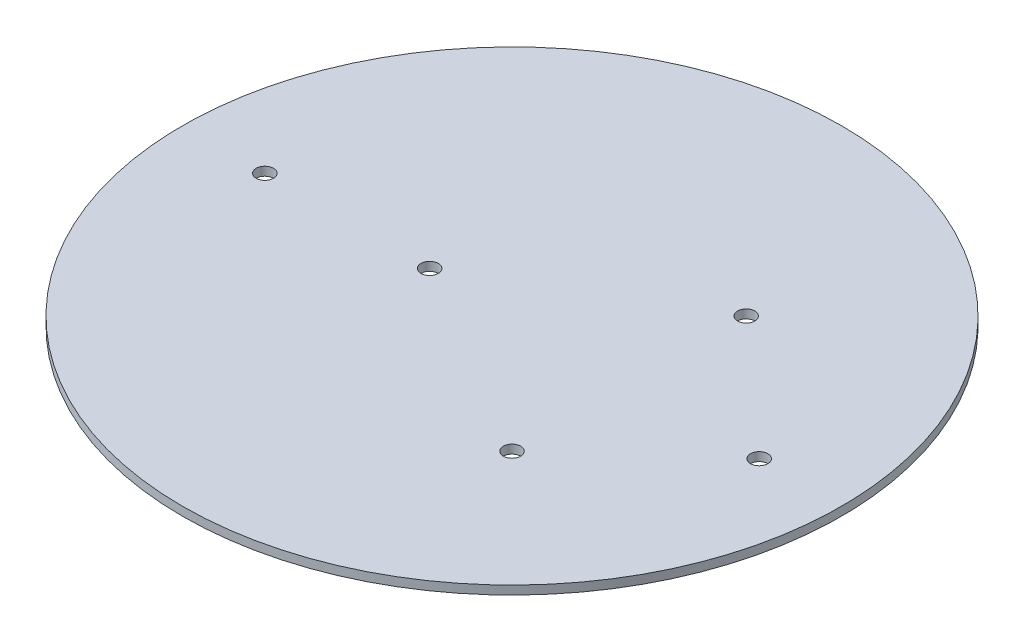
ISO-10303-21;
HEADER;
FILE_DESCRIPTION(('STEP AP214'),'2;1');
FILE_NAME('part.step','',(''),(''),'','','');
FILE_SCHEMA(('AUTOMOTIVE_DESIGN { 1 0 10303 214 1 1 1 1 }'));
ENDSEC;
DATA;
#1=APPLICATION_CONTEXT('core data for automotive mechanical design processes');
#2=APPLICATION_PROTOCOL_DEFINITION('international standard','automotive_design',2000,#1);
#3=PRODUCT_CONTEXT('',#1,'mechanical');
#4=PRODUCT('Part','Part','',(#3));
#5=PRODUCT_RELATED_PRODUCT_CATEGORY('part','',(#4));
#6=PRODUCT_DEFINITION_FORMATION('','',#4);
#7=PRODUCT_DEFINITION_CONTEXT('part definition',#1,'design');
#8=PRODUCT_DEFINITION('design','',#6,#7);
#9=PRODUCT_DEFINITION_SHAPE('','',#8);
#10=(LENGTH_UNIT() NAMED_UNIT(*) SI_UNIT(.MILLI.,.METRE.));
#11=(NAMED_UNIT(*) PLANE_ANGLE_UNIT() SI_UNIT($,.RADIAN.));
#12=(NAMED_UNIT(*) SI_UNIT($,.STERADIAN.) SOLID_ANGLE_UNIT());
#13=UNCERTAINTY_MEASURE_WITH_UNIT(LENGTH_MEASURE(1.E-05),#10,'distance_accuracy_value','');
#14=(GEOMETRIC_REPRESENTATION_CONTEXT(3) GLOBAL_UNCERTAINTY_ASSIGNED_CONTEXT((#13)) GLOBAL_UNIT_ASSIGNED_CONTEXT((#10,
#11,#12)) REPRESENTATION_CONTEXT('',''));
#15=CARTESIAN_POINT('',(0.,0.,0.));
#16=DIRECTION('',(0.,0.,1.));
#17=DIRECTION('',(1.,0.,0.));
#18=AXIS2_PLACEMENT_3D('',#15,#16,#17);
#19=CARTESIAN_POINT('',(-28.5,-1.,0.));
#20=DIRECTION('',(0.,1.,0.));
#21=DIRECTION('',(0.,0.,1.));
#22=AXIS2_PLACEMENT_3D('',#19,#20,#21);
#23=CYLINDRICAL_SURFACE('',#22,1.);
#24=CARTESIAN_POINT('',(-28.5,-1.,0.));
#25=DIRECTION('',(0.,1.,0.));
#26=DIRECTION('',(0.,0.,1.));
#27=AXIS2_PLACEMENT_3D('',#24,#25,#26);
#28=CIRCLE('',#27,1.);
#29=CARTESIAN_POINT('',(-28.5,-1.,1.));
#30=VERTEX_POINT('',#29);
#31=EDGE_CURVE('E52',#30,#30,#28,.T.);
#32=ORIENTED_EDGE('',*,*,#31,.F.);
#33=EDGE_LOOP('',(#32));
#34=FACE_BOUND('',#33,.T.);
#35=CARTESIAN_POINT('',(-28.5,0.,0.));
#36=DIRECTION('',(0.,1.,0.));
#37=DIRECTION('',(0.,0.,1.));
#38=AXIS2_PLACEMENT_3D('',#35,#36,#37);
#39=CIRCLE('',#38,1.);
#40=CARTESIAN_POINT('',(-28.5,0.,1.));
#41=VERTEX_POINT('',#40);
#42=EDGE_CURVE('E77',#41,#41,#39,.T.);
#43=ORIENTED_EDGE('',*,*,#42,.T.);
#44=EDGE_LOOP('',(#43));
#45=FACE_BOUND('',#44,.T.);
#46=ADVANCED_FACE('F43',(#34,#45),#23,.F.);
#47=CARTESIAN_POINT('',(28.5,-1.,0.));
#48=DIRECTION('',(0.,1.,0.));
#49=DIRECTION('',(0.,0.,1.));
#50=AXIS2_PLACEMENT_3D('',#47,#48,#49);
#51=CYLINDRICAL_SURFACE('',#50,1.);
#52=CARTESIAN_POINT('',(28.5,-1.,0.));
#53=DIRECTION('',(0.,1.,0.));
#54=DIRECTION('',(0.,0.,1.));
#55=AXIS2_PLACEMENT_3D('',#52,#53,#54);
#56=CIRCLE('',#55,1.);
#57=CARTESIAN_POINT('',(28.5,-1.,0.999999999999991));
#58=VERTEX_POINT('',#57);
#59=EDGE_CURVE('E58',#58,#58,#56,.T.);
#60=ORIENTED_EDGE('',*,*,#59,.F.);
#61=EDGE_LOOP('',(#60));
#62=FACE_BOUND('',#61,.T.);
#63=CARTESIAN_POINT('',(28.5,0.,0.));
#64=DIRECTION('',(0.,1.,0.));
#65=DIRECTION('',(0.,0.,1.));
#66=AXIS2_PLACEMENT_3D('',#63,#64,#65);
#67=CIRCLE('',#66,1.);
#68=CARTESIAN_POINT('',(28.5,0.,0.999999999999991));
#69=VERTEX_POINT('',#68);
#70=EDGE_CURVE('E74',#69,#69,#67,.T.);
#71=ORIENTED_EDGE('',*,*,#70,.T.);
#72=EDGE_LOOP('',(#71));
#73=FACE_BOUND('',#72,.T.);
#74=ADVANCED_FACE('F107',(#62,#73),#51,.F.);
#75=CARTESIAN_POINT('',(-9.5,-1.,0.));
#76=DIRECTION('',(0.,1.,0.));
#77=DIRECTION('',(0.,0.,1.));
#78=AXIS2_PLACEMENT_3D('',#75,#76,#77);
#79=CYLINDRICAL_SURFACE('',#78,1.);
#80=CARTESIAN_POINT('',(-9.5,-1.,0.));
#81=DIRECTION('',(0.,1.,0.));
#82=DIRECTION('',(0.,0.,1.));
#83=AXIS2_PLACEMENT_3D('',#80,#81,#82);
#84=CIRCLE('',#83,1.);
#85=CARTESIAN_POINT('',(-9.5,-1.,1.));
#86=VERTEX_POINT('',#85);
#87=EDGE_CURVE('E95',#86,#86,#84,.T.);
#88=ORIENTED_EDGE('',*,*,#87,.F.);
#89=EDGE_LOOP('',(#88));
#90=FACE_BOUND('',#89,.T.);
#91=CARTESIAN_POINT('',(-9.5,0.,0.));
#92=DIRECTION('',(0.,1.,0.));
#93=DIRECTION('',(0.,0.,1.));
#94=AXIS2_PLACEMENT_3D('',#91,#92,#93);
#95=CIRCLE('',#94,1.);
#96=CARTESIAN_POINT('',(-9.5,0.,1.));
#97=VERTEX_POINT('',#96);
#98=EDGE_CURVE('E70',#97,#97,#95,.T.);
#99=ORIENTED_EDGE('',*,*,#98,.T.);
#100=EDGE_LOOP('',(#99));
#101=FACE_BOUND('',#100,.T.);
#102=ADVANCED_FACE('F110',(#90,#101),#79,.F.);
#103=CARTESIAN_POINT('',(13.5,-1.,-13.5));
#104=DIRECTION('',(0.,1.,0.));
#105=DIRECTION('',(0.,0.,1.));
#106=AXIS2_PLACEMENT_3D('',#103,#104,#105);
#107=CYLINDRICAL_SURFACE('',#106,0.999999999999999);
#108=CARTESIAN_POINT('',(13.5,-1.,-13.5));
#109=DIRECTION('',(0.,1.,0.));
#110=DIRECTION('',(0.,0.,1.));
#111=AXIS2_PLACEMENT_3D('',#108,#109,#110);
#112=CIRCLE('',#111,0.999999999999999);
#113=CARTESIAN_POINT('',(13.5,-1.,-12.5));
#114=VERTEX_POINT('',#113);
#115=EDGE_CURVE('E89',#114,#114,#112,.T.);
#116=ORIENTED_EDGE('',*,*,#115,.F.);
#117=EDGE_LOOP('',(#116));
#118=FACE_BOUND('',#117,.T.);
#119=CARTESIAN_POINT('',(13.5,0.,-13.5));
#120=DIRECTION('',(0.,1.,0.));
#121=DIRECTION('',(0.,0.,1.));
#122=AXIS2_PLACEMENT_3D('',#119,#120,#121);
#123=CIRCLE('',#122,0.999999999999999);
#124=CARTESIAN_POINT('',(13.5,0.,-12.5));
#125=VERTEX_POINT('',#124);
#126=EDGE_CURVE('E66',#125,#125,#123,.T.);
#127=ORIENTED_EDGE('',*,*,#126,.T.);
#128=EDGE_LOOP('',(#127));
#129=FACE_BOUND('',#128,.T.);
#130=ADVANCED_FACE('F135',(#118,#129),#107,.F.);
#131=CARTESIAN_POINT('',(13.5,-1.,13.5));
#132=DIRECTION('',(0.,1.,0.));
#133=DIRECTION('',(0.,0.,1.));
#134=AXIS2_PLACEMENT_3D('',#131,#132,#133);
#135=CYLINDRICAL_SURFACE('',#134,0.999999999999999);
#136=CARTESIAN_POINT('',(13.5,-1.,13.5));
#137=DIRECTION('',(0.,1.,0.));
#138=DIRECTION('',(0.,0.,1.));
#139=AXIS2_PLACEMENT_3D('',#136,#137,#138);
#140=CIRCLE('',#139,0.999999999999999);
#141=CARTESIAN_POINT('',(13.5,-1.,14.5));
#142=VERTEX_POINT('',#141);
#143=EDGE_CURVE('E84',#142,#142,#140,.T.);
#144=ORIENTED_EDGE('',*,*,#143,.F.);
#145=EDGE_LOOP('',(#144));
#146=FACE_BOUND('',#145,.T.);
#147=CARTESIAN_POINT('',(13.5,0.,13.5));
#148=DIRECTION('',(0.,1.,0.));
#149=DIRECTION('',(0.,0.,1.));
#150=AXIS2_PLACEMENT_3D('',#147,#148,#149);
#151=CIRCLE('',#150,0.999999999999999);
#152=CARTESIAN_POINT('',(13.5,0.,14.5));
#153=VERTEX_POINT('',#152);
#154=EDGE_CURVE('E62',#153,#153,#151,.T.);
#155=ORIENTED_EDGE('',*,*,#154,.T.);
#156=EDGE_LOOP('',(#155));
#157=FACE_BOUND('',#156,.T.);
#158=ADVANCED_FACE('F45',(#146,#157),#135,.F.);
#159=CARTESIAN_POINT('',(0.,-1.,0.));
#160=DIRECTION('',(0.,1.,0.));
#161=DIRECTION('',(0.,0.,1.));
#162=AXIS2_PLACEMENT_3D('',#159,#160,#161);
#163=CYLINDRICAL_SURFACE('',#162,38.);
#164=CARTESIAN_POINT('',(0.,-1.,0.));
#165=DIRECTION('',(0.,1.,0.));
#166=DIRECTION('',(0.,0.,1.));
#167=AXIS2_PLACEMENT_3D('',#164,#165,#166);
#168=CIRCLE('',#167,38.);
#169=CARTESIAN_POINT('',(0.,-1.,38.));
#170=VERTEX_POINT('',#169);
#171=EDGE_CURVE('E10',#170,#170,#168,.T.);
#172=ORIENTED_EDGE('',*,*,#171,.T.);
#173=EDGE_LOOP('',(#172));
#174=FACE_BOUND('',#173,.T.);
#175=CARTESIAN_POINT('',(0.,0.,0.));
#176=DIRECTION('',(0.,1.,0.));
#177=DIRECTION('',(0.,0.,1.));
#178=AXIS2_PLACEMENT_3D('',#175,#176,#177);
#179=CIRCLE('',#178,38.);
#180=CARTESIAN_POINT('',(0.,0.,38.));
#181=VERTEX_POINT('',#180);
#182=EDGE_CURVE('E47',#181,#181,#179,.T.);
#183=ORIENTED_EDGE('',*,*,#182,.F.);
#184=EDGE_LOOP('',(#183));
#185=FACE_BOUND('',#184,.T.);
#186=ADVANCED_FACE('F122',(#174,#185),#163,.T.);
#187=CARTESIAN_POINT('',(0.,-1.,0.));
#188=DIRECTION('',(0.,1.,0.));
#189=DIRECTION('',(0.,0.,1.));
#190=AXIS2_PLACEMENT_3D('',#187,#188,#189);
#191=PLANE('',#190);
#192=ORIENTED_EDGE('',*,*,#143,.T.);
#193=EDGE_LOOP('',(#192));
#194=FACE_BOUND('',#193,.T.);
#195=ORIENTED_EDGE('',*,*,#115,.T.);
#196=EDGE_LOOP('',(#195));
#197=FACE_BOUND('',#196,.T.);
#198=ORIENTED_EDGE('',*,*,#87,.T.);
#199=EDGE_LOOP('',(#198));
#200=FACE_BOUND('',#199,.T.);
#201=ORIENTED_EDGE('',*,*,#59,.T.);
#202=EDGE_LOOP('',(#201));
#203=FACE_BOUND('',#202,.T.);
#204=ORIENTED_EDGE('',*,*,#31,.T.);
#205=EDGE_LOOP('',(#204));
#206=FACE_BOUND('',#205,.T.);
#207=ORIENTED_EDGE('',*,*,#171,.F.);
#208=EDGE_LOOP('',(#207));
#209=FACE_BOUND('',#208,.T.);
#210=ADVANCED_FACE('F104',(#194,#197,#200,#203,#206,#209),#191,.F.);
#211=CARTESIAN_POINT('',(0.,0.,0.));
#212=DIRECTION('',(0.,1.,0.));
#213=DIRECTION('',(0.,0.,1.));
#214=AXIS2_PLACEMENT_3D('',#211,#212,#213);
#215=PLANE('',#214);
#216=ORIENTED_EDGE('',*,*,#154,.F.);
#217=EDGE_LOOP('',(#216));
#218=FACE_BOUND('',#217,.T.);
#219=ORIENTED_EDGE('',*,*,#126,.F.);
#220=EDGE_LOOP('',(#219));
#221=FACE_BOUND('',#220,.T.);
#222=ORIENTED_EDGE('',*,*,#98,.F.);
#223=EDGE_LOOP('',(#222));
#224=FACE_BOUND('',#223,.T.);
#225=ORIENTED_EDGE('',*,*,#70,.F.);
#226=EDGE_LOOP('',(#225));
#227=FACE_BOUND('',#226,.T.);
#228=ORIENTED_EDGE('',*,*,#42,.F.);
#229=EDGE_LOOP('',(#228));
#230=FACE_BOUND('',#229,.T.);
#231=ORIENTED_EDGE('',*,*,#182,.T.);
#232=EDGE_LOOP('',(#231));
#233=FACE_BOUND('',#232,.T.);
#234=ADVANCED_FACE('F114',(#218,#221,#224,#227,#230,#233),#215,.T.);
#235=CLOSED_SHELL('',(#46,#74,#102,#130,#158,#186,#210,#234));
#236=MANIFOLD_SOLID_BREP('B2',#235);
#237=ADVANCED_BREP_SHAPE_REPRESENTATION('',(#18,#236),#14);
#238=SHAPE_DEFINITION_REPRESENTATION(#9,#237);
ENDSEC;
END-ISO-10303-21;
